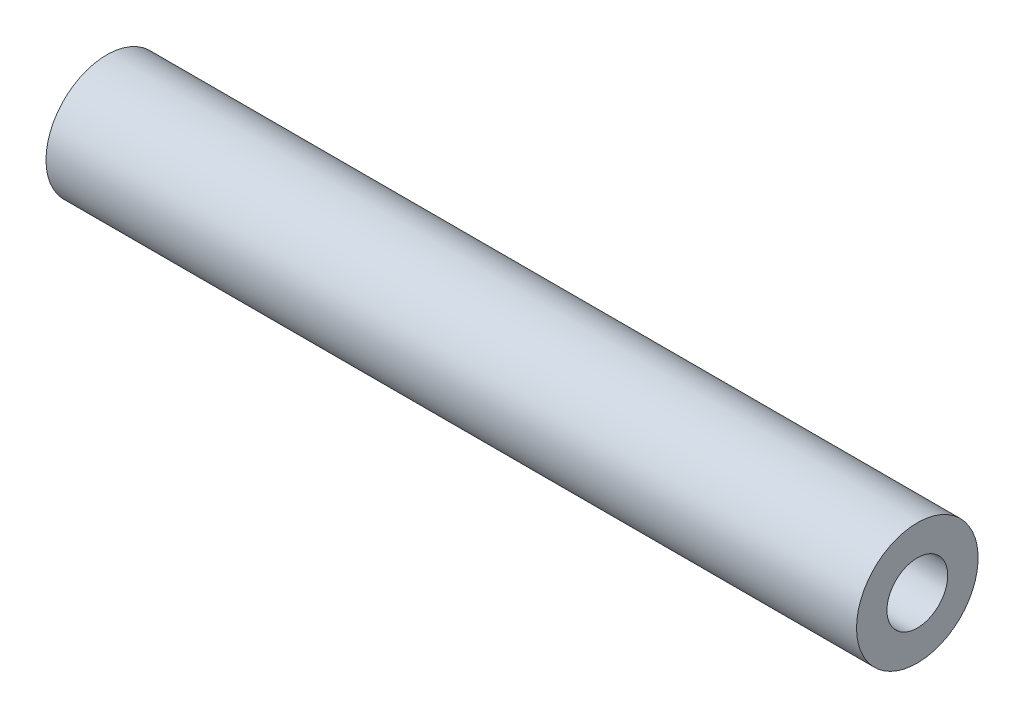
ISO-10303-21;
HEADER;
FILE_DESCRIPTION(('STEP AP214'),'2;1');
FILE_NAME('part.step','',(''),(''),'','','');
FILE_SCHEMA(('AUTOMOTIVE_DESIGN { 1 0 10303 214 1 1 1 1 }'));
ENDSEC;
DATA;
#1=APPLICATION_CONTEXT('core data for automotive mechanical design processes');
#2=APPLICATION_PROTOCOL_DEFINITION('international standard','automotive_design',2000,#1);
#3=PRODUCT_CONTEXT('',#1,'mechanical');
#4=PRODUCT('Part','Part','',(#3));
#5=PRODUCT_RELATED_PRODUCT_CATEGORY('part','',(#4));
#6=PRODUCT_DEFINITION_FORMATION('','',#4);
#7=PRODUCT_DEFINITION_CONTEXT('part definition',#1,'design');
#8=PRODUCT_DEFINITION('design','',#6,#7);
#9=PRODUCT_DEFINITION_SHAPE('','',#8);
#10=(LENGTH_UNIT() NAMED_UNIT(*) SI_UNIT(.MILLI.,.METRE.));
#11=(NAMED_UNIT(*) PLANE_ANGLE_UNIT() SI_UNIT($,.RADIAN.));
#12=(NAMED_UNIT(*) SI_UNIT($,.STERADIAN.) SOLID_ANGLE_UNIT());
#13=UNCERTAINTY_MEASURE_WITH_UNIT(LENGTH_MEASURE(1.E-05),#10,'distance_accuracy_value','');
#14=(GEOMETRIC_REPRESENTATION_CONTEXT(3) GLOBAL_UNCERTAINTY_ASSIGNED_CONTEXT((#13)) GLOBAL_UNIT_ASSIGNED_CONTEXT((#10,
#11,#12)) REPRESENTATION_CONTEXT('',''));
#15=CARTESIAN_POINT('',(0.,0.,0.));
#16=DIRECTION('',(0.,0.,1.));
#17=DIRECTION('',(1.,0.,0.));
#18=AXIS2_PLACEMENT_3D('',#15,#16,#17);
#19=CARTESIAN_POINT('',(20.,15.,0.));
#20=DIRECTION('',(1.,0.,0.));
#21=DIRECTION('',(0.,0.,-1.));
#22=AXIS2_PLACEMENT_3D('',#19,#20,#21);
#23=PLANE('',#22);
#24=CARTESIAN_POINT('',(20.,0.,0.));
#25=DIRECTION('',(-1.,0.,0.));
#26=DIRECTION('',(0.,0.,1.));
#27=AXIS2_PLACEMENT_3D('',#24,#25,#26);
#28=CIRCLE('',#27,7.5);
#29=CARTESIAN_POINT('',(20.,0.,7.5));
#30=VERTEX_POINT('',#29);
#31=EDGE_CURVE('E10',#30,#30,#28,.T.);
#32=ORIENTED_EDGE('',*,*,#31,.F.);
#33=EDGE_LOOP('',(#32));
#34=FACE_BOUND('',#33,.T.);
#35=CARTESIAN_POINT('',(20.,0.,0.));
#36=DIRECTION('',(-1.,0.,0.));
#37=DIRECTION('',(0.,0.,1.));
#38=AXIS2_PLACEMENT_3D('',#35,#36,#37);
#39=CIRCLE('',#38,15.);
#40=CARTESIAN_POINT('',(20.,0.,15.));
#41=VERTEX_POINT('',#40);
#42=EDGE_CURVE('E45',#41,#41,#39,.T.);
#43=ORIENTED_EDGE('',*,*,#42,.T.);
#44=EDGE_LOOP('',(#43));
#45=FACE_BOUND('',#44,.T.);
#46=ADVANCED_FACE('F31',(#34,#45),#23,.F.);
#47=CARTESIAN_POINT('',(0.,0.,0.));
#48=DIRECTION('',(-1.,0.,0.));
#49=DIRECTION('',(0.,0.,1.));
#50=AXIS2_PLACEMENT_3D('',#47,#48,#49);
#51=CYLINDRICAL_SURFACE('',#50,7.5);
#52=CARTESIAN_POINT('',(220.,0.,0.));
#53=DIRECTION('',(-1.,0.,0.));
#54=DIRECTION('',(0.,0.,1.));
#55=AXIS2_PLACEMENT_3D('',#52,#53,#54);
#56=CIRCLE('',#55,7.5);
#57=CARTESIAN_POINT('',(220.,0.,7.5));
#58=VERTEX_POINT('',#57);
#59=EDGE_CURVE('E37',#58,#58,#56,.T.);
#60=ORIENTED_EDGE('',*,*,#59,.F.);
#61=EDGE_LOOP('',(#60));
#62=FACE_BOUND('',#61,.T.);
#63=ORIENTED_EDGE('',*,*,#31,.T.);
#64=EDGE_LOOP('',(#63));
#65=FACE_BOUND('',#64,.T.);
#66=ADVANCED_FACE('F60',(#62,#65),#51,.F.);
#67=CARTESIAN_POINT('',(220.,15.,0.));
#68=DIRECTION('',(-1.,0.,0.));
#69=DIRECTION('',(0.,0.,1.));
#70=AXIS2_PLACEMENT_3D('',#67,#68,#69);
#71=PLANE('',#70);
#72=CARTESIAN_POINT('',(220.,0.,0.));
#73=DIRECTION('',(-1.,0.,0.));
#74=DIRECTION('',(0.,0.,1.));
#75=AXIS2_PLACEMENT_3D('',#72,#73,#74);
#76=CIRCLE('',#75,15.);
#77=CARTESIAN_POINT('',(220.,0.,15.));
#78=VERTEX_POINT('',#77);
#79=EDGE_CURVE('E41',#78,#78,#76,.T.);
#80=ORIENTED_EDGE('',*,*,#79,.F.);
#81=EDGE_LOOP('',(#80));
#82=FACE_BOUND('',#81,.T.);
#83=ORIENTED_EDGE('',*,*,#59,.T.);
#84=EDGE_LOOP('',(#83));
#85=FACE_BOUND('',#84,.T.);
#86=ADVANCED_FACE('F55',(#82,#85),#71,.F.);
#87=CARTESIAN_POINT('',(0.,0.,0.));
#88=DIRECTION('',(-1.,0.,0.));
#89=DIRECTION('',(0.,0.,1.));
#90=AXIS2_PLACEMENT_3D('',#87,#88,#89);
#91=CYLINDRICAL_SURFACE('',#90,15.);
#92=ORIENTED_EDGE('',*,*,#42,.F.);
#93=EDGE_LOOP('',(#92));
#94=FACE_BOUND('',#93,.T.);
#95=ORIENTED_EDGE('',*,*,#79,.T.);
#96=EDGE_LOOP('',(#95));
#97=FACE_BOUND('',#96,.T.);
#98=ADVANCED_FACE('F52',(#94,#97),#91,.T.);
#99=CLOSED_SHELL('',(#46,#66,#86,#98));
#100=MANIFOLD_SOLID_BREP('B2',#99);
#101=ADVANCED_BREP_SHAPE_REPRESENTATION('',(#18,#100),#14);
#102=SHAPE_DEFINITION_REPRESENTATION(#9,#101);
ENDSEC;
END-ISO-10303-21;
